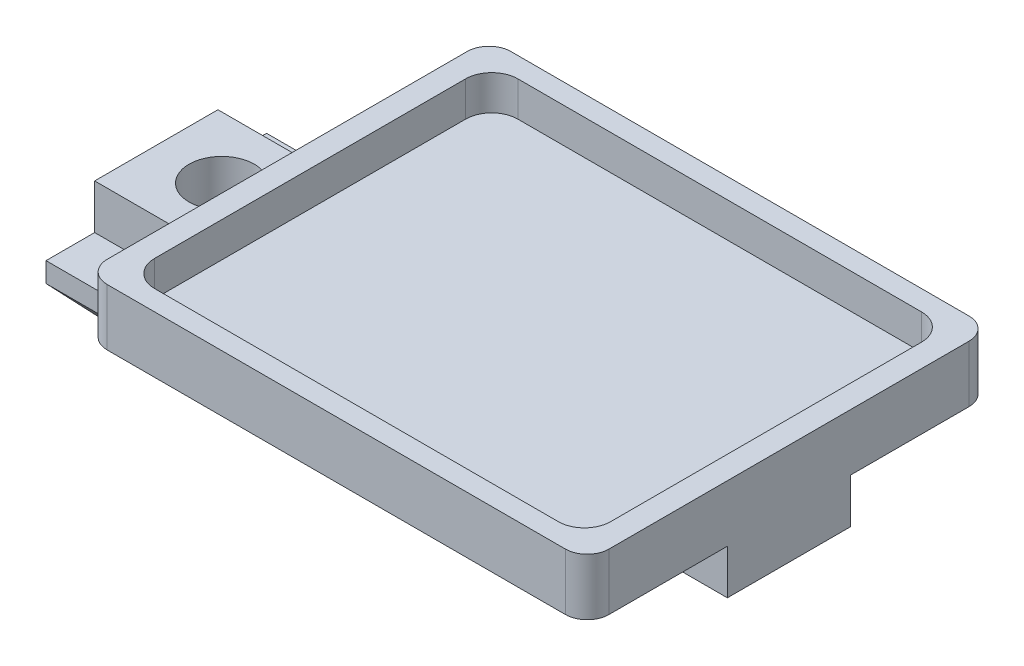
ISO-10303-21;
HEADER;
FILE_DESCRIPTION(('STEP AP214'),'2;1');
FILE_NAME('part.step','',(''),(''),'','','');
FILE_SCHEMA(('AUTOMOTIVE_DESIGN { 1 0 10303 214 1 1 1 1 }'));
ENDSEC;
DATA;
#1=APPLICATION_CONTEXT('core data for automotive mechanical design processes');
#2=APPLICATION_PROTOCOL_DEFINITION('international standard','automotive_design',2000,#1);
#3=PRODUCT_CONTEXT('',#1,'mechanical');
#4=PRODUCT('Part','Part','',(#3));
#5=PRODUCT_RELATED_PRODUCT_CATEGORY('part','',(#4));
#6=PRODUCT_DEFINITION_FORMATION('','',#4);
#7=PRODUCT_DEFINITION_CONTEXT('part definition',#1,'design');
#8=PRODUCT_DEFINITION('design','',#6,#7);
#9=PRODUCT_DEFINITION_SHAPE('','',#8);
#10=(LENGTH_UNIT() NAMED_UNIT(*) SI_UNIT(.MILLI.,.METRE.));
#11=(NAMED_UNIT(*) PLANE_ANGLE_UNIT() SI_UNIT($,.RADIAN.));
#12=(NAMED_UNIT(*) SI_UNIT($,.STERADIAN.) SOLID_ANGLE_UNIT());
#13=UNCERTAINTY_MEASURE_WITH_UNIT(LENGTH_MEASURE(1.E-05),#10,'distance_accuracy_value','');
#14=(GEOMETRIC_REPRESENTATION_CONTEXT(3) GLOBAL_UNCERTAINTY_ASSIGNED_CONTEXT((#13)) GLOBAL_UNIT_ASSIGNED_CONTEXT((#10,
#11,#12)) REPRESENTATION_CONTEXT('',''));
#15=CARTESIAN_POINT('',(0.,0.,0.));
#16=DIRECTION('',(0.,0.,1.));
#17=DIRECTION('',(1.,0.,0.));
#18=AXIS2_PLACEMENT_3D('',#15,#16,#17);
#19=CARTESIAN_POINT('',(-14.5,-8.99999999999999,0.));
#20=DIRECTION('',(0.,1.,0.));
#21=DIRECTION('',(0.,0.,1.));
#22=AXIS2_PLACEMENT_3D('',#19,#20,#21);
#23=CYLINDRICAL_SURFACE('',#22,1.5);
#24=CARTESIAN_POINT('',(-14.5,0.,0.));
#25=DIRECTION('',(0.,1.,0.));
#26=DIRECTION('',(0.,0.,1.));
#27=AXIS2_PLACEMENT_3D('',#24,#25,#26);
#28=CIRCLE('',#27,1.5);
#29=CARTESIAN_POINT('',(-14.5,0.,1.5));
#30=VERTEX_POINT('',#29);
#31=EDGE_CURVE('E229',#30,#30,#28,.T.);
#32=ORIENTED_EDGE('',*,*,#31,.T.);
#33=EDGE_LOOP('',(#32));
#34=FACE_BOUND('',#33,.T.);
#35=CARTESIAN_POINT('',(-14.5,-2.85000000000087,0.));
#36=DIRECTION('',(0.,-1.,0.));
#37=DIRECTION('',(0.,0.,-1.));
#38=AXIS2_PLACEMENT_3D('',#35,#36,#37);
#39=CIRCLE('',#38,1.5);
#40=CARTESIAN_POINT('',(-14.5,-2.85000000000087,-1.5));
#41=VERTEX_POINT('',#40);
#42=EDGE_CURVE('E36',#41,#41,#39,.F.);
#43=ORIENTED_EDGE('',*,*,#42,.F.);
#44=EDGE_LOOP('',(#43));
#45=FACE_BOUND('',#44,.T.);
#46=ADVANCED_FACE('F32',(#34,#45),#23,.F.);
#47=CARTESIAN_POINT('',(0.,0.,0.));
#48=DIRECTION('',(0.,-1.,0.));
#49=DIRECTION('',(0.,0.,-1.));
#50=AXIS2_PLACEMENT_3D('',#47,#48,#49);
#51=PLANE('',#50);
#52=DIRECTION('',(0.,0.,-1.));
#53=VECTOR('',#52,1.);
#54=CARTESIAN_POINT('',(11.5,0.,9.25));
#55=LINE('',#54,#53);
#56=CARTESIAN_POINT('',(11.5,0.,-2.82500448499157));
#57=VERTEX_POINT('',#56);
#58=CARTESIAN_POINT('',(11.5,0.,-8.25));
#59=VERTEX_POINT('',#58);
#60=EDGE_CURVE('E391',#57,#59,#55,.T.);
#61=ORIENTED_EDGE('',*,*,#60,.F.);
#62=DIRECTION('',(1.,0.,0.));
#63=VECTOR('',#62,1.);
#64=CARTESIAN_POINT('',(-17.5,0.,-2.82500411367632));
#65=LINE('',#64,#63);
#66=CARTESIAN_POINT('',(-11.5,0.,-2.82500411367632));
#67=VERTEX_POINT('',#66);
#68=EDGE_CURVE('E296',#67,#57,#65,.T.);
#69=ORIENTED_EDGE('',*,*,#68,.F.);
#70=DIRECTION('',(0.,0.,1.));
#71=VECTOR('',#70,1.);
#72=CARTESIAN_POINT('',(-11.5,0.,9.25));
#73=LINE('',#72,#71);
#74=CARTESIAN_POINT('',(-11.5,0.,-8.25));
#75=VERTEX_POINT('',#74);
#76=EDGE_CURVE('E399',#75,#67,#73,.T.);
#77=ORIENTED_EDGE('',*,*,#76,.F.);
#78=CARTESIAN_POINT('',(-10.5,0.,-8.25));
#79=DIRECTION('',(0.,-1.,0.));
#80=DIRECTION('',(0.,0.,-1.));
#81=AXIS2_PLACEMENT_3D('',#78,#79,#80);
#82=CIRCLE('',#81,1.);
#83=CARTESIAN_POINT('',(-10.5,0.,-9.25));
#84=VERTEX_POINT('',#83);
#85=EDGE_CURVE('E419',#75,#84,#82,.T.);
#86=ORIENTED_EDGE('',*,*,#85,.T.);
#87=DIRECTION('',(-1.,0.,0.));
#88=VECTOR('',#87,1.);
#89=CARTESIAN_POINT('',(-11.5,0.,-9.25));
#90=LINE('',#89,#88);
#91=CARTESIAN_POINT('',(10.5,0.,-9.25));
#92=VERTEX_POINT('',#91);
#93=EDGE_CURVE('E395',#92,#84,#90,.T.);
#94=ORIENTED_EDGE('',*,*,#93,.F.);
#95=CARTESIAN_POINT('',(10.5,0.,-8.25));
#96=DIRECTION('',(0.,-1.,0.));
#97=DIRECTION('',(0.,0.,-1.));
#98=AXIS2_PLACEMENT_3D('',#95,#96,#97);
#99=CIRCLE('',#98,1.);
#100=EDGE_CURVE('E413',#92,#59,#99,.T.);
#101=ORIENTED_EDGE('',*,*,#100,.T.);
#102=EDGE_LOOP('',(#61,#69,#77,#86,#94,#101));
#103=FACE_BOUND('',#102,.T.);
#104=ADVANCED_FACE('F486',(#103),#51,.T.);
#105=DIRECTION('',(1.,0.,0.));
#106=VECTOR('',#105,1.);
#107=CARTESIAN_POINT('',(-17.5,0.,2.8249982145693));
#108=LINE('',#107,#106);
#109=CARTESIAN_POINT('',(-11.5,0.,2.8249982145693));
#110=VERTEX_POINT('',#109);
#111=CARTESIAN_POINT('',(11.5,0.,2.8249982145693));
#112=VERTEX_POINT('',#111);
#113=EDGE_CURVE('E292',#110,#112,#108,.T.);
#114=ORIENTED_EDGE('',*,*,#113,.T.);
#115=CARTESIAN_POINT('',(11.5,0.,8.25));
#116=VERTEX_POINT('',#115);
#117=EDGE_CURVE('E392',#116,#112,#55,.T.);
#118=ORIENTED_EDGE('',*,*,#117,.F.);
#119=CARTESIAN_POINT('',(10.5,0.,8.25));
#120=DIRECTION('',(0.,-1.,0.));
#121=DIRECTION('',(0.,0.,-1.));
#122=AXIS2_PLACEMENT_3D('',#119,#120,#121);
#123=CIRCLE('',#122,1.);
#124=CARTESIAN_POINT('',(10.5,0.,9.25));
#125=VERTEX_POINT('',#124);
#126=EDGE_CURVE('E411',#116,#125,#123,.T.);
#127=ORIENTED_EDGE('',*,*,#126,.T.);
#128=DIRECTION('',(1.,0.,0.));
#129=VECTOR('',#128,1.);
#130=CARTESIAN_POINT('',(-11.5,0.,9.25));
#131=LINE('',#130,#129);
#132=CARTESIAN_POINT('',(-10.5,0.,9.25));
#133=VERTEX_POINT('',#132);
#134=EDGE_CURVE('E402',#133,#125,#131,.T.);
#135=ORIENTED_EDGE('',*,*,#134,.F.);
#136=CARTESIAN_POINT('',(-10.5,0.,8.25));
#137=DIRECTION('',(0.,-1.,0.));
#138=DIRECTION('',(0.,0.,-1.));
#139=AXIS2_PLACEMENT_3D('',#136,#137,#138);
#140=CIRCLE('',#139,1.);
#141=CARTESIAN_POINT('',(-11.5,0.,8.25));
#142=VERTEX_POINT('',#141);
#143=EDGE_CURVE('E416',#133,#142,#140,.T.);
#144=ORIENTED_EDGE('',*,*,#143,.T.);
#145=EDGE_CURVE('E398',#110,#142,#73,.T.);
#146=ORIENTED_EDGE('',*,*,#145,.F.);
#147=EDGE_LOOP('',(#114,#118,#127,#135,#144,#146));
#148=FACE_BOUND('',#147,.T.);
#149=ADVANCED_FACE('F492',(#148),#51,.T.);
#150=CARTESIAN_POINT('',(11.5,1.,9.25));
#151=DIRECTION('',(-1.,0.,0.));
#152=DIRECTION('',(0.,0.,1.));
#153=AXIS2_PLACEMENT_3D('',#150,#151,#152);
#154=PLANE('',#153);
#155=ORIENTED_EDGE('',*,*,#117,.T.);
#156=DIRECTION('',(0.,1.,0.));
#157=VECTOR('',#156,1.);
#158=CARTESIAN_POINT('',(11.5,0.,2.8249982145693));
#159=LINE('',#158,#157);
#160=CARTESIAN_POINT('',(11.5,-2.05000000000086,2.8249982145693));
#161=VERTEX_POINT('',#160);
#162=EDGE_CURVE('E239',#161,#112,#159,.T.);
#163=ORIENTED_EDGE('',*,*,#162,.F.);
#164=DIRECTION('',(0.,2.43901636594014E-07,0.99999999999997));
#165=VECTOR('',#164,1.);
#166=CARTESIAN_POINT('',(11.5,-2.05000000000086,2.8249982145693));
#167=LINE('',#166,#165);
#168=CARTESIAN_POINT('',(11.5,-2.05000137804577,-2.82500448499157));
#169=VERTEX_POINT('',#168);
#170=EDGE_CURVE('E253',#169,#161,#167,.T.);
#171=ORIENTED_EDGE('',*,*,#170,.F.);
#172=DIRECTION('',(0.,-0.999999999999984,-1.81129269029981E-07));
#173=VECTOR('',#172,1.);
#174=CARTESIAN_POINT('',(11.5,-2.05000137804577,-2.82500448499157));
#175=LINE('',#174,#173);
#176=EDGE_CURVE('E254',#57,#169,#175,.T.);
#177=ORIENTED_EDGE('',*,*,#176,.F.);
#178=ORIENTED_EDGE('',*,*,#60,.T.);
#179=DIRECTION('',(0.,-1.,0.));
#180=VECTOR('',#179,1.);
#181=CARTESIAN_POINT('',(11.5,1.,-8.25));
#182=LINE('',#181,#180);
#183=CARTESIAN_POINT('',(11.5,2.6,-8.25));
#184=VERTEX_POINT('',#183);
#185=EDGE_CURVE('E434',#59,#184,#182,.F.);
#186=ORIENTED_EDGE('',*,*,#185,.T.);
#187=DIRECTION('',(0.,0.,-1.));
#188=VECTOR('',#187,1.);
#189=CARTESIAN_POINT('',(11.5,2.6,8.25));
#190=LINE('',#189,#188);
#191=CARTESIAN_POINT('',(11.5,2.6,8.25));
#192=VERTEX_POINT('',#191);
#193=EDGE_CURVE('E388',#192,#184,#190,.T.);
#194=ORIENTED_EDGE('',*,*,#193,.F.);
#195=DIRECTION('',(0.,-1.,0.));
#196=VECTOR('',#195,1.);
#197=CARTESIAN_POINT('',(11.5,1.,8.25));
#198=LINE('',#197,#196);
#199=EDGE_CURVE('E431',#192,#116,#198,.T.);
#200=ORIENTED_EDGE('',*,*,#199,.T.);
#201=EDGE_LOOP('',(#155,#163,#171,#177,#178,#186,#194,#200));
#202=FACE_BOUND('',#201,.T.);
#203=ADVANCED_FACE('F467',(#202),#154,.F.);
#204=CARTESIAN_POINT('',(-11.5,1.,-9.25));
#205=DIRECTION('',(0.,0.,1.));
#206=DIRECTION('',(1.,0.,0.));
#207=AXIS2_PLACEMENT_3D('',#204,#205,#206);
#208=PLANE('',#207);
#209=ORIENTED_EDGE('',*,*,#93,.T.);
#210=DIRECTION('',(0.,-1.,0.));
#211=VECTOR('',#210,1.);
#212=CARTESIAN_POINT('',(-10.5,1.,-9.25));
#213=LINE('',#212,#211);
#214=CARTESIAN_POINT('',(-10.5,2.6,-9.25));
#215=VERTEX_POINT('',#214);
#216=EDGE_CURVE('E424',#84,#215,#213,.F.);
#217=ORIENTED_EDGE('',*,*,#216,.T.);
#218=DIRECTION('',(-1.,0.,0.));
#219=VECTOR('',#218,1.);
#220=CARTESIAN_POINT('',(10.5,2.6,-9.25));
#221=LINE('',#220,#219);
#222=CARTESIAN_POINT('',(10.5,2.6,-9.25));
#223=VERTEX_POINT('',#222);
#224=EDGE_CURVE('E370',#223,#215,#221,.T.);
#225=ORIENTED_EDGE('',*,*,#224,.F.);
#226=DIRECTION('',(0.,-1.,0.));
#227=VECTOR('',#226,1.);
#228=CARTESIAN_POINT('',(10.5,1.,-9.25));
#229=LINE('',#228,#227);
#230=EDGE_CURVE('E421',#223,#92,#229,.T.);
#231=ORIENTED_EDGE('',*,*,#230,.T.);
#232=EDGE_LOOP('',(#209,#217,#225,#231));
#233=FACE_BOUND('',#232,.T.);
#234=ADVANCED_FACE('F575',(#233),#208,.F.);
#235=CARTESIAN_POINT('',(-11.5,1.,9.25));
#236=DIRECTION('',(1.,0.,0.));
#237=DIRECTION('',(0.,0.,-1.));
#238=AXIS2_PLACEMENT_3D('',#235,#236,#237);
#239=PLANE('',#238);
#240=DIRECTION('',(0.,-1.,0.));
#241=VECTOR('',#240,1.);
#242=CARTESIAN_POINT('',(-11.5,1.,8.25));
#243=LINE('',#242,#241);
#244=CARTESIAN_POINT('',(-11.5,2.6,8.25));
#245=VERTEX_POINT('',#244);
#246=EDGE_CURVE('E406',#142,#245,#243,.F.);
#247=ORIENTED_EDGE('',*,*,#246,.T.);
#248=DIRECTION('',(0.,0.,1.));
#249=VECTOR('',#248,1.);
#250=CARTESIAN_POINT('',(-11.5,2.6,-8.25));
#251=LINE('',#250,#249);
#252=CARTESIAN_POINT('',(-11.5,2.6,-8.25));
#253=VERTEX_POINT('',#252);
#254=EDGE_CURVE('E376',#253,#245,#251,.T.);
#255=ORIENTED_EDGE('',*,*,#254,.F.);
#256=DIRECTION('',(0.,-1.,0.));
#257=VECTOR('',#256,1.);
#258=CARTESIAN_POINT('',(-11.5,1.,-8.25));
#259=LINE('',#258,#257);
#260=EDGE_CURVE('E408',#253,#75,#259,.T.);
#261=ORIENTED_EDGE('',*,*,#260,.T.);
#262=ORIENTED_EDGE('',*,*,#76,.T.);
#263=EDGE_CURVE('E403',#67,#110,#73,.T.);
#264=ORIENTED_EDGE('',*,*,#263,.T.);
#265=ORIENTED_EDGE('',*,*,#145,.T.);
#266=EDGE_LOOP('',(#247,#255,#261,#262,#264,#265));
#267=FACE_BOUND('',#266,.T.);
#268=ADVANCED_FACE('F571',(#267),#239,.F.);
#269=CARTESIAN_POINT('',(-11.5,1.,9.25));
#270=DIRECTION('',(0.,0.,-1.));
#271=DIRECTION('',(-1.,0.,0.));
#272=AXIS2_PLACEMENT_3D('',#269,#270,#271);
#273=PLANE('',#272);
#274=DIRECTION('',(0.,-1.,0.));
#275=VECTOR('',#274,1.);
#276=CARTESIAN_POINT('',(10.5,1.,9.25));
#277=LINE('',#276,#275);
#278=CARTESIAN_POINT('',(10.5,2.6,9.25));
#279=VERTEX_POINT('',#278);
#280=EDGE_CURVE('E426',#125,#279,#277,.F.);
#281=ORIENTED_EDGE('',*,*,#280,.T.);
#282=DIRECTION('',(1.,0.,0.));
#283=VECTOR('',#282,1.);
#284=CARTESIAN_POINT('',(-10.5,2.6,9.25));
#285=LINE('',#284,#283);
#286=CARTESIAN_POINT('',(-10.5,2.6,9.25));
#287=VERTEX_POINT('',#286);
#288=EDGE_CURVE('E382',#287,#279,#285,.T.);
#289=ORIENTED_EDGE('',*,*,#288,.F.);
#290=DIRECTION('',(0.,-1.,0.));
#291=VECTOR('',#290,1.);
#292=CARTESIAN_POINT('',(-10.5,1.,9.25));
#293=LINE('',#292,#291);
#294=EDGE_CURVE('E428',#287,#133,#293,.T.);
#295=ORIENTED_EDGE('',*,*,#294,.T.);
#296=ORIENTED_EDGE('',*,*,#134,.T.);
#297=EDGE_LOOP('',(#281,#289,#295,#296));
#298=FACE_BOUND('',#297,.T.);
#299=ADVANCED_FACE('F567',(#298),#273,.F.);
#300=CARTESIAN_POINT('',(-10.5,1.,-8.25));
#301=DIRECTION('',(0.,-1.,0.));
#302=DIRECTION('',(0.,0.,-1.));
#303=AXIS2_PLACEMENT_3D('',#300,#301,#302);
#304=CYLINDRICAL_SURFACE('',#303,1.);
#305=ORIENTED_EDGE('',*,*,#260,.F.);
#306=CARTESIAN_POINT('',(-10.5,2.6,-8.25));
#307=DIRECTION('',(0.,1.,0.));
#308=DIRECTION('',(0.,0.,1.));
#309=AXIS2_PLACEMENT_3D('',#306,#307,#308);
#310=CIRCLE('',#309,0.999999999999997);
#311=EDGE_CURVE('E373',#215,#253,#310,.T.);
#312=ORIENTED_EDGE('',*,*,#311,.F.);
#313=ORIENTED_EDGE('',*,*,#216,.F.);
#314=ORIENTED_EDGE('',*,*,#85,.F.);
#315=EDGE_LOOP('',(#305,#312,#313,#314));
#316=FACE_BOUND('',#315,.T.);
#317=ADVANCED_FACE('F570',(#316),#304,.T.);
#318=CARTESIAN_POINT('',(-10.5,1.,8.25));
#319=DIRECTION('',(0.,-1.,0.));
#320=DIRECTION('',(0.,0.,-1.));
#321=AXIS2_PLACEMENT_3D('',#318,#319,#320);
#322=CYLINDRICAL_SURFACE('',#321,1.);
#323=ORIENTED_EDGE('',*,*,#294,.F.);
#324=CARTESIAN_POINT('',(-10.5,2.6,8.25));
#325=DIRECTION('',(0.,1.,0.));
#326=DIRECTION('',(0.,0.,1.));
#327=AXIS2_PLACEMENT_3D('',#324,#325,#326);
#328=CIRCLE('',#327,0.999999999999999);
#329=EDGE_CURVE('E379',#245,#287,#328,.T.);
#330=ORIENTED_EDGE('',*,*,#329,.F.);
#331=ORIENTED_EDGE('',*,*,#246,.F.);
#332=ORIENTED_EDGE('',*,*,#143,.F.);
#333=EDGE_LOOP('',(#323,#330,#331,#332));
#334=FACE_BOUND('',#333,.T.);
#335=ADVANCED_FACE('F584',(#334),#322,.T.);
#336=CARTESIAN_POINT('',(10.5,1.,-8.25));
#337=DIRECTION('',(0.,-1.,0.));
#338=DIRECTION('',(0.,0.,-1.));
#339=AXIS2_PLACEMENT_3D('',#336,#337,#338);
#340=CYLINDRICAL_SURFACE('',#339,1.);
#341=ORIENTED_EDGE('',*,*,#230,.F.);
#342=CARTESIAN_POINT('',(10.5,2.6,-8.25));
#343=DIRECTION('',(0.,1.,0.));
#344=DIRECTION('',(0.,0.,1.));
#345=AXIS2_PLACEMENT_3D('',#342,#343,#344);
#346=CIRCLE('',#345,1.);
#347=EDGE_CURVE('E367',#184,#223,#346,.T.);
#348=ORIENTED_EDGE('',*,*,#347,.F.);
#349=ORIENTED_EDGE('',*,*,#185,.F.);
#350=ORIENTED_EDGE('',*,*,#100,.F.);
#351=EDGE_LOOP('',(#341,#348,#349,#350));
#352=FACE_BOUND('',#351,.T.);
#353=ADVANCED_FACE('F588',(#352),#340,.T.);
#354=CARTESIAN_POINT('',(10.5,1.,8.25));
#355=DIRECTION('',(0.,-1.,0.));
#356=DIRECTION('',(0.,0.,-1.));
#357=AXIS2_PLACEMENT_3D('',#354,#355,#356);
#358=CYLINDRICAL_SURFACE('',#357,1.);
#359=ORIENTED_EDGE('',*,*,#199,.F.);
#360=CARTESIAN_POINT('',(10.5,2.6,8.25));
#361=DIRECTION('',(0.,1.,0.));
#362=DIRECTION('',(0.,0.,1.));
#363=AXIS2_PLACEMENT_3D('',#360,#361,#362);
#364=CIRCLE('',#363,0.999999999999999);
#365=EDGE_CURVE('E385',#279,#192,#364,.T.);
#366=ORIENTED_EDGE('',*,*,#365,.F.);
#367=ORIENTED_EDGE('',*,*,#280,.F.);
#368=ORIENTED_EDGE('',*,*,#126,.F.);
#369=EDGE_LOOP('',(#359,#366,#367,#368));
#370=FACE_BOUND('',#369,.T.);
#371=ADVANCED_FACE('F562',(#370),#358,.T.);
#372=CARTESIAN_POINT('',(10.5,2.6,-8.25));
#373=DIRECTION('',(0.,1.,0.));
#374=DIRECTION('',(0.,0.,1.));
#375=AXIS2_PLACEMENT_3D('',#372,#373,#374);
#376=PLANE('',#375);
#377=ORIENTED_EDGE('',*,*,#347,.T.);
#378=ORIENTED_EDGE('',*,*,#224,.T.);
#379=ORIENTED_EDGE('',*,*,#311,.T.);
#380=ORIENTED_EDGE('',*,*,#254,.T.);
#381=ORIENTED_EDGE('',*,*,#329,.T.);
#382=ORIENTED_EDGE('',*,*,#288,.T.);
#383=ORIENTED_EDGE('',*,*,#365,.T.);
#384=ORIENTED_EDGE('',*,*,#193,.T.);
#385=EDGE_LOOP('',(#377,#378,#379,#380,#381,#382,#383,#384));
#386=FACE_BOUND('',#385,.T.);
#387=DIRECTION('',(0.,0.,1.));
#388=VECTOR('',#387,1.);
#389=CARTESIAN_POINT('',(-10.45,2.6,-7.125));
#390=LINE('',#389,#388);
#391=CARTESIAN_POINT('',(-10.45,2.6,-7.125));
#392=VERTEX_POINT('',#391);
#393=CARTESIAN_POINT('',(-10.45,2.6,7.125));
#394=VERTEX_POINT('',#393);
#395=EDGE_CURVE('E312',#392,#394,#390,.T.);
#396=ORIENTED_EDGE('',*,*,#395,.F.);
#397=CARTESIAN_POINT('',(-9.25,2.6,-7.125));
#398=DIRECTION('',(0.,1.,0.));
#399=DIRECTION('',(0.,0.,1.));
#400=AXIS2_PLACEMENT_3D('',#397,#398,#399);
#401=CIRCLE('',#400,1.2);
#402=CARTESIAN_POINT('',(-9.25,2.6,-8.325));
#403=VERTEX_POINT('',#402);
#404=EDGE_CURVE('E310',#403,#392,#401,.T.);
#405=ORIENTED_EDGE('',*,*,#404,.F.);
#406=DIRECTION('',(-1.,0.,0.));
#407=VECTOR('',#406,1.);
#408=CARTESIAN_POINT('',(9.25,2.6,-8.325));
#409=LINE('',#408,#407);
#410=CARTESIAN_POINT('',(9.25,2.6,-8.325));
#411=VERTEX_POINT('',#410);
#412=EDGE_CURVE('E326',#411,#403,#409,.T.);
#413=ORIENTED_EDGE('',*,*,#412,.F.);
#414=CARTESIAN_POINT('',(9.25,2.6,-7.125));
#415=DIRECTION('',(0.,1.,0.));
#416=DIRECTION('',(0.,0.,1.));
#417=AXIS2_PLACEMENT_3D('',#414,#415,#416);
#418=CIRCLE('',#417,1.2);
#419=CARTESIAN_POINT('',(10.45,2.6,-7.125));
#420=VERTEX_POINT('',#419);
#421=EDGE_CURVE('E323',#420,#411,#418,.T.);
#422=ORIENTED_EDGE('',*,*,#421,.F.);
#423=DIRECTION('',(0.,0.,-1.));
#424=VECTOR('',#423,1.);
#425=CARTESIAN_POINT('',(10.45,2.6,7.125));
#426=LINE('',#425,#424);
#427=CARTESIAN_POINT('',(10.45,2.6,7.125));
#428=VERTEX_POINT('',#427);
#429=EDGE_CURVE('E321',#428,#420,#426,.T.);
#430=ORIENTED_EDGE('',*,*,#429,.F.);
#431=CARTESIAN_POINT('',(9.25,2.6,7.125));
#432=DIRECTION('',(0.,1.,0.));
#433=DIRECTION('',(0.,0.,1.));
#434=AXIS2_PLACEMENT_3D('',#431,#432,#433);
#435=CIRCLE('',#434,1.2);
#436=CARTESIAN_POINT('',(9.25,2.6,8.325));
#437=VERTEX_POINT('',#436);
#438=EDGE_CURVE('E319',#437,#428,#435,.T.);
#439=ORIENTED_EDGE('',*,*,#438,.F.);
#440=DIRECTION('',(1.,0.,0.));
#441=VECTOR('',#440,1.);
#442=CARTESIAN_POINT('',(-9.25,2.6,8.325));
#443=LINE('',#442,#441);
#444=CARTESIAN_POINT('',(-9.25,2.6,8.325));
#445=VERTEX_POINT('',#444);
#446=EDGE_CURVE('E317',#445,#437,#443,.T.);
#447=ORIENTED_EDGE('',*,*,#446,.F.);
#448=CARTESIAN_POINT('',(-9.25,2.6,7.125));
#449=DIRECTION('',(0.,1.,0.));
#450=DIRECTION('',(0.,0.,1.));
#451=AXIS2_PLACEMENT_3D('',#448,#449,#450);
#452=CIRCLE('',#451,1.2);
#453=EDGE_CURVE('E315',#394,#445,#452,.T.);
#454=ORIENTED_EDGE('',*,*,#453,.F.);
#455=EDGE_LOOP('',(#396,#405,#413,#422,#430,#439,#447,#454));
#456=FACE_BOUND('',#455,.T.);
#457=ADVANCED_FACE('F558',(#386,#456),#376,.T.);
#458=CARTESIAN_POINT('',(-9.25,2.6,-7.125));
#459=DIRECTION('',(0.,-1.,0.));
#460=DIRECTION('',(0.,0.,-1.));
#461=AXIS2_PLACEMENT_3D('',#458,#459,#460);
#462=CYLINDRICAL_SURFACE('',#461,1.2);
#463=CARTESIAN_POINT('',(-9.25,1.,-7.125));
#464=DIRECTION('',(0.,1.,0.));
#465=DIRECTION('',(0.,0.,1.));
#466=AXIS2_PLACEMENT_3D('',#463,#464,#465);
#467=CIRCLE('',#466,1.2);
#468=CARTESIAN_POINT('',(-9.25,1.,-8.325));
#469=VERTEX_POINT('',#468);
#470=CARTESIAN_POINT('',(-10.45,1.,-7.125));
#471=VERTEX_POINT('',#470);
#472=EDGE_CURVE('E290',#469,#471,#467,.T.);
#473=ORIENTED_EDGE('',*,*,#472,.F.);
#474=DIRECTION('',(0.,-1.,0.));
#475=VECTOR('',#474,1.);
#476=CARTESIAN_POINT('',(-9.25,2.6,-8.325));
#477=LINE('',#476,#475);
#478=EDGE_CURVE('E328',#403,#469,#477,.T.);
#479=ORIENTED_EDGE('',*,*,#478,.F.);
#480=ORIENTED_EDGE('',*,*,#404,.T.);
#481=DIRECTION('',(0.,-1.,0.));
#482=VECTOR('',#481,1.);
#483=CARTESIAN_POINT('',(-10.45,2.6,-7.125));
#484=LINE('',#483,#482);
#485=EDGE_CURVE('E364',#392,#471,#484,.T.);
#486=ORIENTED_EDGE('',*,*,#485,.T.);
#487=EDGE_LOOP('',(#473,#479,#480,#486));
#488=FACE_BOUND('',#487,.T.);
#489=ADVANCED_FACE('F554',(#488),#462,.F.);
#490=CARTESIAN_POINT('',(-10.45,2.6,-7.125));
#491=DIRECTION('',(1.,0.,0.));
#492=DIRECTION('',(0.,0.,-1.));
#493=AXIS2_PLACEMENT_3D('',#490,#491,#492);
#494=PLANE('',#493);
#495=DIRECTION('',(0.,0.,1.));
#496=VECTOR('',#495,1.);
#497=CARTESIAN_POINT('',(-10.45,1.,-7.125));
#498=LINE('',#497,#496);
#499=CARTESIAN_POINT('',(-10.45,1.,7.125));
#500=VERTEX_POINT('',#499);
#501=EDGE_CURVE('E331',#471,#500,#498,.T.);
#502=ORIENTED_EDGE('',*,*,#501,.F.);
#503=ORIENTED_EDGE('',*,*,#485,.F.);
#504=ORIENTED_EDGE('',*,*,#395,.T.);
#505=DIRECTION('',(0.,-1.,0.));
#506=VECTOR('',#505,1.);
#507=CARTESIAN_POINT('',(-10.45,2.6,7.125));
#508=LINE('',#507,#506);
#509=EDGE_CURVE('E362',#394,#500,#508,.T.);
#510=ORIENTED_EDGE('',*,*,#509,.T.);
#511=EDGE_LOOP('',(#502,#503,#504,#510));
#512=FACE_BOUND('',#511,.T.);
#513=ADVANCED_FACE('F550',(#512),#494,.T.);
#514=CARTESIAN_POINT('',(-9.25,2.6,7.125));
#515=DIRECTION('',(0.,-1.,0.));
#516=DIRECTION('',(0.,0.,-1.));
#517=AXIS2_PLACEMENT_3D('',#514,#515,#516);
#518=CYLINDRICAL_SURFACE('',#517,1.2);
#519=CARTESIAN_POINT('',(-9.25,1.,7.125));
#520=DIRECTION('',(0.,1.,0.));
#521=DIRECTION('',(0.,0.,1.));
#522=AXIS2_PLACEMENT_3D('',#519,#520,#521);
#523=CIRCLE('',#522,1.2);
#524=CARTESIAN_POINT('',(-9.25,1.,8.325));
#525=VERTEX_POINT('',#524);
#526=EDGE_CURVE('E334',#500,#525,#523,.T.);
#527=ORIENTED_EDGE('',*,*,#526,.F.);
#528=ORIENTED_EDGE('',*,*,#509,.F.);
#529=ORIENTED_EDGE('',*,*,#453,.T.);
#530=DIRECTION('',(0.,-1.,0.));
#531=VECTOR('',#530,1.);
#532=CARTESIAN_POINT('',(-9.25,2.6,8.325));
#533=LINE('',#532,#531);
#534=EDGE_CURVE('E360',#445,#525,#533,.T.);
#535=ORIENTED_EDGE('',*,*,#534,.T.);
#536=EDGE_LOOP('',(#527,#528,#529,#535));
#537=FACE_BOUND('',#536,.T.);
#538=ADVANCED_FACE('F546',(#537),#518,.F.);
#539=CARTESIAN_POINT('',(-9.25,2.6,8.325));
#540=DIRECTION('',(0.,0.,-1.));
#541=DIRECTION('',(-1.,0.,0.));
#542=AXIS2_PLACEMENT_3D('',#539,#540,#541);
#543=PLANE('',#542);
#544=DIRECTION('',(1.,0.,0.));
#545=VECTOR('',#544,1.);
#546=CARTESIAN_POINT('',(-9.25,1.,8.325));
#547=LINE('',#546,#545);
#548=CARTESIAN_POINT('',(9.25,1.,8.325));
#549=VERTEX_POINT('',#548);
#550=EDGE_CURVE('E337',#525,#549,#547,.T.);
#551=ORIENTED_EDGE('',*,*,#550,.F.);
#552=ORIENTED_EDGE('',*,*,#534,.F.);
#553=ORIENTED_EDGE('',*,*,#446,.T.);
#554=DIRECTION('',(0.,-1.,0.));
#555=VECTOR('',#554,1.);
#556=CARTESIAN_POINT('',(9.25,2.6,8.325));
#557=LINE('',#556,#555);
#558=EDGE_CURVE('E358',#437,#549,#557,.T.);
#559=ORIENTED_EDGE('',*,*,#558,.T.);
#560=EDGE_LOOP('',(#551,#552,#553,#559));
#561=FACE_BOUND('',#560,.T.);
#562=ADVANCED_FACE('F542',(#561),#543,.T.);
#563=CARTESIAN_POINT('',(9.25,2.6,7.125));
#564=DIRECTION('',(0.,-1.,0.));
#565=DIRECTION('',(0.,0.,-1.));
#566=AXIS2_PLACEMENT_3D('',#563,#564,#565);
#567=CYLINDRICAL_SURFACE('',#566,1.2);
#568=CARTESIAN_POINT('',(9.25,1.,7.125));
#569=DIRECTION('',(0.,1.,0.));
#570=DIRECTION('',(0.,0.,1.));
#571=AXIS2_PLACEMENT_3D('',#568,#569,#570);
#572=CIRCLE('',#571,1.2);
#573=CARTESIAN_POINT('',(10.45,1.,7.125));
#574=VERTEX_POINT('',#573);
#575=EDGE_CURVE('E340',#549,#574,#572,.T.);
#576=ORIENTED_EDGE('',*,*,#575,.F.);
#577=ORIENTED_EDGE('',*,*,#558,.F.);
#578=ORIENTED_EDGE('',*,*,#438,.T.);
#579=DIRECTION('',(0.,-1.,0.));
#580=VECTOR('',#579,1.);
#581=CARTESIAN_POINT('',(10.45,2.6,7.125));
#582=LINE('',#581,#580);
#583=EDGE_CURVE('E356',#428,#574,#582,.T.);
#584=ORIENTED_EDGE('',*,*,#583,.T.);
#585=EDGE_LOOP('',(#576,#577,#578,#584));
#586=FACE_BOUND('',#585,.T.);
#587=ADVANCED_FACE('F538',(#586),#567,.F.);
#588=CARTESIAN_POINT('',(10.45,2.6,7.125));
#589=DIRECTION('',(-1.,0.,0.));
#590=DIRECTION('',(0.,0.,1.));
#591=AXIS2_PLACEMENT_3D('',#588,#589,#590);
#592=PLANE('',#591);
#593=DIRECTION('',(0.,0.,-1.));
#594=VECTOR('',#593,1.);
#595=CARTESIAN_POINT('',(10.45,1.,7.125));
#596=LINE('',#595,#594);
#597=CARTESIAN_POINT('',(10.45,1.,-7.125));
#598=VERTEX_POINT('',#597);
#599=EDGE_CURVE('E343',#574,#598,#596,.T.);
#600=ORIENTED_EDGE('',*,*,#599,.F.);
#601=ORIENTED_EDGE('',*,*,#583,.F.);
#602=ORIENTED_EDGE('',*,*,#429,.T.);
#603=DIRECTION('',(0.,-1.,0.));
#604=VECTOR('',#603,1.);
#605=CARTESIAN_POINT('',(10.45,2.6,-7.125));
#606=LINE('',#605,#604);
#607=EDGE_CURVE('E354',#420,#598,#606,.T.);
#608=ORIENTED_EDGE('',*,*,#607,.T.);
#609=EDGE_LOOP('',(#600,#601,#602,#608));
#610=FACE_BOUND('',#609,.T.);
#611=ADVANCED_FACE('F534',(#610),#592,.T.);
#612=CARTESIAN_POINT('',(9.25,2.6,-7.125));
#613=DIRECTION('',(0.,-1.,0.));
#614=DIRECTION('',(0.,0.,-1.));
#615=AXIS2_PLACEMENT_3D('',#612,#613,#614);
#616=CYLINDRICAL_SURFACE('',#615,1.2);
#617=CARTESIAN_POINT('',(9.25,1.,-7.125));
#618=DIRECTION('',(0.,1.,0.));
#619=DIRECTION('',(0.,0.,1.));
#620=AXIS2_PLACEMENT_3D('',#617,#618,#619);
#621=CIRCLE('',#620,1.2);
#622=CARTESIAN_POINT('',(9.25,1.,-8.325));
#623=VERTEX_POINT('',#622);
#624=EDGE_CURVE('E346',#598,#623,#621,.T.);
#625=ORIENTED_EDGE('',*,*,#624,.F.);
#626=ORIENTED_EDGE('',*,*,#607,.F.);
#627=ORIENTED_EDGE('',*,*,#421,.T.);
#628=DIRECTION('',(0.,-1.,0.));
#629=VECTOR('',#628,1.);
#630=CARTESIAN_POINT('',(9.25,2.6,-8.325));
#631=LINE('',#630,#629);
#632=EDGE_CURVE('E352',#411,#623,#631,.T.);
#633=ORIENTED_EDGE('',*,*,#632,.T.);
#634=EDGE_LOOP('',(#625,#626,#627,#633));
#635=FACE_BOUND('',#634,.T.);
#636=ADVANCED_FACE('F530',(#635),#616,.F.);
#637=CARTESIAN_POINT('',(9.25,2.6,-8.325));
#638=DIRECTION('',(0.,0.,1.));
#639=DIRECTION('',(1.,0.,0.));
#640=AXIS2_PLACEMENT_3D('',#637,#638,#639);
#641=PLANE('',#640);
#642=DIRECTION('',(-1.,0.,0.));
#643=VECTOR('',#642,1.);
#644=CARTESIAN_POINT('',(9.25,1.,-8.325));
#645=LINE('',#644,#643);
#646=EDGE_CURVE('E313',#623,#469,#645,.T.);
#647=ORIENTED_EDGE('',*,*,#646,.F.);
#648=ORIENTED_EDGE('',*,*,#632,.F.);
#649=ORIENTED_EDGE('',*,*,#412,.T.);
#650=ORIENTED_EDGE('',*,*,#478,.T.);
#651=EDGE_LOOP('',(#647,#648,#649,#650));
#652=FACE_BOUND('',#651,.T.);
#653=ADVANCED_FACE('F527',(#652),#641,.T.);
#654=CARTESIAN_POINT('',(0.,1.,0.));
#655=DIRECTION('',(0.,-1.,0.));
#656=DIRECTION('',(0.,0.,-1.));
#657=AXIS2_PLACEMENT_3D('',#654,#655,#656);
#658=PLANE('',#657);
#659=ORIENTED_EDGE('',*,*,#646,.T.);
#660=ORIENTED_EDGE('',*,*,#472,.T.);
#661=ORIENTED_EDGE('',*,*,#501,.T.);
#662=ORIENTED_EDGE('',*,*,#526,.T.);
#663=ORIENTED_EDGE('',*,*,#550,.T.);
#664=ORIENTED_EDGE('',*,*,#575,.T.);
#665=ORIENTED_EDGE('',*,*,#599,.T.);
#666=ORIENTED_EDGE('',*,*,#624,.T.);
#667=EDGE_LOOP('',(#659,#660,#661,#662,#663,#664,#665,#666));
#668=FACE_BOUND('',#667,.T.);
#669=ADVANCED_FACE('F508',(#668),#658,.F.);
#670=CARTESIAN_POINT('',(-17.5,0.,2.8249982145693));
#671=DIRECTION('',(0.,1.,0.));
#672=DIRECTION('',(0.,0.,1.));
#673=AXIS2_PLACEMENT_3D('',#670,#671,#672);
#674=PLANE('',#673);
#675=ORIENTED_EDGE('',*,*,#31,.F.);
#676=EDGE_LOOP('',(#675));
#677=FACE_BOUND('',#676,.T.);
#678=ORIENTED_EDGE('',*,*,#263,.F.);
#679=CARTESIAN_POINT('',(-17.5,0.,-2.82500411367632));
#680=VERTEX_POINT('',#679);
#681=EDGE_CURVE('E291',#680,#67,#65,.T.);
#682=ORIENTED_EDGE('',*,*,#681,.F.);
#683=DIRECTION('',(0.,0.,1.));
#684=VECTOR('',#683,1.);
#685=CARTESIAN_POINT('',(-17.5,0.,2.8249982145693));
#686=LINE('',#685,#684);
#687=CARTESIAN_POINT('',(-17.5,0.,2.8249982145693));
#688=VERTEX_POINT('',#687);
#689=EDGE_CURVE('E250',#680,#688,#686,.T.);
#690=ORIENTED_EDGE('',*,*,#689,.T.);
#691=EDGE_CURVE('E287',#688,#110,#108,.T.);
#692=ORIENTED_EDGE('',*,*,#691,.T.);
#693=EDGE_LOOP('',(#678,#682,#690,#692));
#694=FACE_BOUND('',#693,.T.);
#695=ADVANCED_FACE('F505',(#677,#694),#674,.T.);
#696=CARTESIAN_POINT('',(-17.5,-0.434236645223261,2.8249982145693));
#697=DIRECTION('',(0.,0.,1.));
#698=DIRECTION('',(1.,0.,0.));
#699=AXIS2_PLACEMENT_3D('',#696,#697,#698);
#700=PLANE('',#699);
#701=DIRECTION('',(1.,0.,0.));
#702=VECTOR('',#701,1.);
#703=CARTESIAN_POINT('',(-17.5,-2.05000000000086,2.8249982145693));
#704=LINE('',#703,#702);
#705=CARTESIAN_POINT('',(-17.5,-2.05000000000086,2.8249982145693));
#706=VERTEX_POINT('',#705);
#707=CARTESIAN_POINT('',(0.,-2.05000000000086,2.8249982145693));
#708=VERTEX_POINT('',#707);
#709=EDGE_CURVE('E236',#706,#708,#704,.T.);
#710=ORIENTED_EDGE('',*,*,#709,.T.);
#711=DIRECTION('',(-1.,0.,0.));
#712=VECTOR('',#711,1.);
#713=CARTESIAN_POINT('',(17.5104106477873,-2.05000000000086,2.8249982145693));
#714=LINE('',#713,#712);
#715=EDGE_CURVE('E246',#161,#708,#714,.T.);
#716=ORIENTED_EDGE('',*,*,#715,.F.);
#717=ORIENTED_EDGE('',*,*,#162,.T.);
#718=ORIENTED_EDGE('',*,*,#113,.F.);
#719=ORIENTED_EDGE('',*,*,#691,.F.);
#720=DIRECTION('',(0.,-1.,0.));
#721=VECTOR('',#720,1.);
#722=CARTESIAN_POINT('',(-17.5,-0.434236645223261,2.8249982145693));
#723=LINE('',#722,#721);
#724=EDGE_CURVE('E249',#688,#706,#723,.T.);
#725=ORIENTED_EDGE('',*,*,#724,.T.);
#726=EDGE_LOOP('',(#710,#716,#717,#718,#719,#725));
#727=FACE_BOUND('',#726,.T.);
#728=ADVANCED_FACE('F244',(#727),#700,.T.);
#729=CARTESIAN_POINT('',(-17.5,-0.520868560351398,-2.82500411367633));
#730=DIRECTION('',(0.,0.,-1.));
#731=DIRECTION('',(0.,1.,0.));
#732=AXIS2_PLACEMENT_3D('',#729,#730,#731);
#733=PLANE('',#732);
#734=ORIENTED_EDGE('',*,*,#68,.T.);
#735=ORIENTED_EDGE('',*,*,#176,.T.);
#736=DIRECTION('',(-1.,0.,0.));
#737=VECTOR('',#736,1.);
#738=CARTESIAN_POINT('',(17.5104106477873,-2.05000137804577,-2.82500448499157));
#739=LINE('',#738,#737);
#740=CARTESIAN_POINT('',(0.,-2.05000137804577,-2.82500448499157));
#741=VERTEX_POINT('',#740);
#742=EDGE_CURVE('E228',#169,#741,#739,.T.);
#743=ORIENTED_EDGE('',*,*,#742,.T.);
#744=DIRECTION('',(1.,0.,0.));
#745=VECTOR('',#744,1.);
#746=CARTESIAN_POINT('',(-17.5,-2.05000137804577,-2.82500448499157));
#747=LINE('',#746,#745);
#748=CARTESIAN_POINT('',(-17.5,-2.05000137804577,-2.82500448499157));
#749=VERTEX_POINT('',#748);
#750=EDGE_CURVE('E295',#749,#741,#747,.T.);
#751=ORIENTED_EDGE('',*,*,#750,.F.);
#752=DIRECTION('',(0.,0.99999999999997,2.42827332598546E-07));
#753=VECTOR('',#752,1.);
#754=CARTESIAN_POINT('',(-17.5,-2.05000137804577,-2.82500448499157));
#755=LINE('',#754,#753);
#756=EDGE_CURVE('E282',#749,#680,#755,.T.);
#757=ORIENTED_EDGE('',*,*,#756,.T.);
#758=ORIENTED_EDGE('',*,*,#681,.T.);
#759=EDGE_LOOP('',(#734,#735,#743,#751,#757,#758));
#760=FACE_BOUND('',#759,.T.);
#761=ADVANCED_FACE('F462',(#760),#733,.T.);
#762=CARTESIAN_POINT('',(-17.5,-2.05000083662551,-5.05465590707345));
#763=DIRECTION('',(0.,0.999999999999971,2.42827308289765E-07));
#764=DIRECTION('',(0.,-2.42827308289765E-07,0.999999999999971));
#765=AXIS2_PLACEMENT_3D('',#762,#763,#764);
#766=PLANE('',#765);
#767=DIRECTION('',(0.,-2.42827308289765E-07,0.99999999999997));
#768=VECTOR('',#767,1.);
#769=CARTESIAN_POINT('',(0.,-2.05000083662551,-5.05465590707345));
#770=LINE('',#769,#768);
#771=CARTESIAN_POINT('',(0.,-2.05000083662551,-5.05465590707345));
#772=VERTEX_POINT('',#771);
#773=EDGE_CURVE('E224',#772,#741,#770,.T.);
#774=ORIENTED_EDGE('',*,*,#773,.F.);
#775=DIRECTION('',(1.,0.,0.));
#776=VECTOR('',#775,1.);
#777=CARTESIAN_POINT('',(-17.5,-2.05000083662551,-5.05465590707345));
#778=LINE('',#777,#776);
#779=CARTESIAN_POINT('',(-17.5,-2.05000083662551,-5.05465590707345));
#780=VERTEX_POINT('',#779);
#781=EDGE_CURVE('E298',#780,#772,#778,.T.);
#782=ORIENTED_EDGE('',*,*,#781,.F.);
#783=DIRECTION('',(0.,-2.42827308289765E-07,0.99999999999997));
#784=VECTOR('',#783,1.);
#785=CARTESIAN_POINT('',(-17.5,-2.05000083662551,-5.05465590707345));
#786=LINE('',#785,#784);
#787=EDGE_CURVE('E279',#780,#749,#786,.T.);
#788=ORIENTED_EDGE('',*,*,#787,.T.);
#789=ORIENTED_EDGE('',*,*,#750,.T.);
#790=EDGE_LOOP('',(#774,#782,#788,#789));
#791=FACE_BOUND('',#790,.T.);
#792=ADVANCED_FACE('F460',(#791),#766,.T.);
#793=CARTESIAN_POINT('',(-17.5,-3.09644660940693,-5.05465590707345));
#794=DIRECTION('',(0.,0.,-1.));
#795=DIRECTION('',(-1.,0.,0.));
#796=AXIS2_PLACEMENT_3D('',#793,#794,#795);
#797=PLANE('',#796);
#798=ORIENTED_EDGE('',*,*,#781,.T.);
#799=CARTESIAN_POINT('',(-5.58211429478115,0.149999999999128,-5.05465590707345));
#800=DIRECTION('',(0.,0.,-1.));
#801=DIRECTION('',(-1.,0.,0.));
#802=AXIS2_PLACEMENT_3D('',#799,#800,#801);
#803=CIRCLE('',#802,6.);
#804=CARTESIAN_POINT('',(-0.536266059620302,-3.09644660940693,-5.05465590707345));
#805=VERTEX_POINT('',#804);
#806=EDGE_CURVE('E436',#772,#805,#803,.T.);
#807=ORIENTED_EDGE('',*,*,#806,.T.);
#808=DIRECTION('',(1.,0.,0.));
#809=VECTOR('',#808,1.);
#810=CARTESIAN_POINT('',(-17.5,-3.09644660940693,-5.05465590707345));
#811=LINE('',#810,#809);
#812=CARTESIAN_POINT('',(-17.5,-3.09644660940693,-5.05465590707345));
#813=VERTEX_POINT('',#812);
#814=EDGE_CURVE('E300',#813,#805,#811,.T.);
#815=ORIENTED_EDGE('',*,*,#814,.F.);
#816=DIRECTION('',(0.,1.,0.));
#817=VECTOR('',#816,1.);
#818=CARTESIAN_POINT('',(-17.5,-3.09644660940693,-5.05465590707345));
#819=LINE('',#818,#817);
#820=EDGE_CURVE('E276',#813,#780,#819,.T.);
#821=ORIENTED_EDGE('',*,*,#820,.T.);
#822=EDGE_LOOP('',(#798,#807,#815,#821));
#823=FACE_BOUND('',#822,.T.);
#824=ADVANCED_FACE('F458',(#823),#797,.T.);
#825=CARTESIAN_POINT('',(-17.5,-5.85000000000087,-2.30110251647951));
#826=DIRECTION('',(0.,-0.707106781186548,-0.707106781186548));
#827=DIRECTION('',(0.,0.707106781186548,-0.707106781186548));
#828=AXIS2_PLACEMENT_3D('',#825,#826,#827);
#829=PLANE('',#828);
#830=ORIENTED_EDGE('',*,*,#814,.T.);
#831=CARTESIAN_POINT('',(-5.58211429478115,0.149999999999128,-8.30110251647951));
#832=DIRECTION('',(0.,-0.707106781186548,-0.707106781186548));
#833=DIRECTION('',(0.,0.707106781186548,-0.707106781186548));
#834=AXIS2_PLACEMENT_3D('',#831,#832,#833);
#835=ELLIPSE('',#834,8.48528137423857,6.);
#836=CARTESIAN_POINT('',(-5.58211429478115,-5.85000000000087,-2.30110251647951));
#837=VERTEX_POINT('',#836);
#838=EDGE_CURVE('E438',#805,#837,#835,.T.);
#839=ORIENTED_EDGE('',*,*,#838,.T.);
#840=DIRECTION('',(1.,0.,0.));
#841=VECTOR('',#840,1.);
#842=CARTESIAN_POINT('',(-17.5,-5.85000000000087,-2.30110251647951));
#843=LINE('',#842,#841);
#844=CARTESIAN_POINT('',(-17.5,-5.85000000000087,-2.30110251647951));
#845=VERTEX_POINT('',#844);
#846=EDGE_CURVE('E303',#845,#837,#843,.T.);
#847=ORIENTED_EDGE('',*,*,#846,.F.);
#848=DIRECTION('',(0.,0.707106781186547,-0.707106781186547));
#849=VECTOR('',#848,1.);
#850=CARTESIAN_POINT('',(-17.5,-5.85000000000087,-2.30110251647951));
#851=LINE('',#850,#849);
#852=EDGE_CURVE('E273',#845,#813,#851,.T.);
#853=ORIENTED_EDGE('',*,*,#852,.T.);
#854=EDGE_LOOP('',(#830,#839,#847,#853));
#855=FACE_BOUND('',#854,.T.);
#856=ADVANCED_FACE('F443',(#855),#829,.T.);
#857=CARTESIAN_POINT('',(-17.5,-5.85000000000087,2.29762172638616));
#858=DIRECTION('',(0.,-1.,0.));
#859=DIRECTION('',(0.,0.,-1.));
#860=AXIS2_PLACEMENT_3D('',#857,#858,#859);
#861=PLANE('',#860);
#862=CARTESIAN_POINT('',(-14.5,-5.85000000000087,0.));
#863=DIRECTION('',(0.,-1.,0.));
#864=DIRECTION('',(0.,0.,-1.));
#865=AXIS2_PLACEMENT_3D('',#862,#863,#864);
#866=CIRCLE('',#865,1.85);
#867=CARTESIAN_POINT('',(-14.5,-5.85000000000087,-1.85));
#868=VERTEX_POINT('',#867);
#869=EDGE_CURVE('E473',#868,#868,#866,.T.);
#870=ORIENTED_EDGE('',*,*,#869,.F.);
#871=EDGE_LOOP('',(#870));
#872=FACE_BOUND('',#871,.T.);
#873=ORIENTED_EDGE('',*,*,#846,.T.);
#874=DIRECTION('',(0.,0.,1.));
#875=VECTOR('',#874,1.);
#876=CARTESIAN_POINT('',(-5.58211429478115,-5.85000000000087,2.29762172638616));
#877=LINE('',#876,#875);
#878=CARTESIAN_POINT('',(-5.58211429478115,-5.85000000000087,2.29762172638616));
#879=VERTEX_POINT('',#878);
#880=EDGE_CURVE('E55',#837,#879,#877,.T.);
#881=ORIENTED_EDGE('',*,*,#880,.T.);
#882=DIRECTION('',(1.,0.,0.));
#883=VECTOR('',#882,1.);
#884=CARTESIAN_POINT('',(-17.5,-5.85000000000087,2.29762172638616));
#885=LINE('',#884,#883);
#886=CARTESIAN_POINT('',(-17.5,-5.85000000000087,2.29762172638616));
#887=VERTEX_POINT('',#886);
#888=EDGE_CURVE('E305',#887,#879,#885,.T.);
#889=ORIENTED_EDGE('',*,*,#888,.F.);
#890=DIRECTION('',(0.,0.,-1.));
#891=VECTOR('',#890,1.);
#892=CARTESIAN_POINT('',(-17.5,-5.85000000000087,2.29762172638616));
#893=LINE('',#892,#891);
#894=EDGE_CURVE('E270',#887,#845,#893,.T.);
#895=ORIENTED_EDGE('',*,*,#894,.T.);
#896=EDGE_LOOP('',(#873,#881,#889,#895));
#897=FACE_BOUND('',#896,.T.);
#898=ADVANCED_FACE('F445',(#872,#897),#861,.T.);
#899=CARTESIAN_POINT('',(-17.5,-2.95951263263296,5.05465233621203));
#900=DIRECTION('',(0.,-0.690204420991452,0.723614439631946));
#901=DIRECTION('',(0.,-0.723614439631946,-0.690204420991452));
#902=AXIS2_PLACEMENT_3D('',#899,#900,#901);
#903=PLANE('',#902);
#904=ORIENTED_EDGE('',*,*,#888,.T.);
#905=CARTESIAN_POINT('',(-5.58211429478115,0.149999999999128,8.02059559083125));
#906=DIRECTION('',(0.,-0.690204420991452,0.723614439631946));
#907=DIRECTION('',(0.,-0.723614439631946,-0.690204420991452));
#908=AXIS2_PLACEMENT_3D('',#905,#906,#907);
#909=ELLIPSE('',#908,8.29170850025021,6.);
#910=CARTESIAN_POINT('',(-0.450746914881185,-2.95951263263296,5.05465233621203));
#911=VERTEX_POINT('',#910);
#912=EDGE_CURVE('E41',#879,#911,#909,.T.);
#913=ORIENTED_EDGE('',*,*,#912,.T.);
#914=DIRECTION('',(1.,0.,0.));
#915=VECTOR('',#914,1.);
#916=CARTESIAN_POINT('',(-17.5,-2.95951263263296,5.05465233621203));
#917=LINE('',#916,#915);
#918=CARTESIAN_POINT('',(-17.5,-2.95951263263296,5.05465233621203));
#919=VERTEX_POINT('',#918);
#920=EDGE_CURVE('E307',#919,#911,#917,.T.);
#921=ORIENTED_EDGE('',*,*,#920,.F.);
#922=DIRECTION('',(0.,-0.723614439631946,-0.690204420991451));
#923=VECTOR('',#922,1.);
#924=CARTESIAN_POINT('',(-17.5,-2.95951263263296,5.05465233621203));
#925=LINE('',#924,#923);
#926=EDGE_CURVE('E267',#919,#887,#925,.T.);
#927=ORIENTED_EDGE('',*,*,#926,.T.);
#928=EDGE_LOOP('',(#904,#913,#921,#927));
#929=FACE_BOUND('',#928,.T.);
#930=ADVANCED_FACE('F451',(#929),#903,.T.);
#931=CARTESIAN_POINT('',(-17.5,-2.05000000000086,5.05465233621203));
#932=DIRECTION('',(0.,0.,1.));
#933=DIRECTION('',(1.,0.,0.));
#934=AXIS2_PLACEMENT_3D('',#931,#932,#933);
#935=PLANE('',#934);
#936=ORIENTED_EDGE('',*,*,#920,.T.);
#937=CARTESIAN_POINT('',(-5.58211429478115,0.149999999999128,5.05465233621203));
#938=DIRECTION('',(0.,0.,1.));
#939=DIRECTION('',(1.,0.,0.));
#940=AXIS2_PLACEMENT_3D('',#937,#938,#939);
#941=CIRCLE('',#940,6.);
#942=CARTESIAN_POINT('',(0.,-2.05000000000086,5.05465233621203));
#943=VERTEX_POINT('',#942);
#944=EDGE_CURVE('E11',#911,#943,#941,.T.);
#945=ORIENTED_EDGE('',*,*,#944,.T.);
#946=DIRECTION('',(1.,0.,0.));
#947=VECTOR('',#946,1.);
#948=CARTESIAN_POINT('',(-17.5,-2.05000000000086,5.05465233621203));
#949=LINE('',#948,#947);
#950=CARTESIAN_POINT('',(-17.5,-2.05000000000086,5.05465233621203));
#951=VERTEX_POINT('',#950);
#952=EDGE_CURVE('E238',#951,#943,#949,.T.);
#953=ORIENTED_EDGE('',*,*,#952,.F.);
#954=DIRECTION('',(0.,-1.,0.));
#955=VECTOR('',#954,1.);
#956=CARTESIAN_POINT('',(-17.5,-2.05000000000086,5.05465233621203));
#957=LINE('',#956,#955);
#958=EDGE_CURVE('E264',#951,#919,#957,.T.);
#959=ORIENTED_EDGE('',*,*,#958,.T.);
#960=EDGE_LOOP('',(#936,#945,#953,#959));
#961=FACE_BOUND('',#960,.T.);
#962=ADVANCED_FACE('F448',(#961),#935,.T.);
#963=CARTESIAN_POINT('',(-17.5,-2.05000000000086,2.8249982145693));
#964=DIRECTION('',(0.,1.,0.));
#965=DIRECTION('',(0.,0.,1.));
#966=AXIS2_PLACEMENT_3D('',#963,#964,#965);
#967=PLANE('',#966);
#968=DIRECTION('',(0.,0.,1.));
#969=VECTOR('',#968,1.);
#970=CARTESIAN_POINT('',(0.,-2.05000000000086,2.8249982145693));
#971=LINE('',#970,#969);
#972=EDGE_CURVE('E221',#708,#943,#971,.T.);
#973=ORIENTED_EDGE('',*,*,#972,.F.);
#974=ORIENTED_EDGE('',*,*,#709,.F.);
#975=DIRECTION('',(0.,0.,1.));
#976=VECTOR('',#975,1.);
#977=CARTESIAN_POINT('',(-17.5,-2.05000000000086,2.8249982145693));
#978=LINE('',#977,#976);
#979=EDGE_CURVE('E262',#706,#951,#978,.T.);
#980=ORIENTED_EDGE('',*,*,#979,.T.);
#981=ORIENTED_EDGE('',*,*,#952,.T.);
#982=EDGE_LOOP('',(#973,#974,#980,#981));
#983=FACE_BOUND('',#982,.T.);
#984=ADVANCED_FACE('F234',(#983),#967,.T.);
#985=CARTESIAN_POINT('',(-17.5,0.,0.));
#986=DIRECTION('',(-1.,0.,0.));
#987=DIRECTION('',(0.,0.,1.));
#988=AXIS2_PLACEMENT_3D('',#985,#986,#987);
#989=PLANE('',#988);
#990=ORIENTED_EDGE('',*,*,#724,.F.);
#991=ORIENTED_EDGE('',*,*,#689,.F.);
#992=ORIENTED_EDGE('',*,*,#756,.F.);
#993=ORIENTED_EDGE('',*,*,#787,.F.);
#994=ORIENTED_EDGE('',*,*,#820,.F.);
#995=ORIENTED_EDGE('',*,*,#852,.F.);
#996=ORIENTED_EDGE('',*,*,#894,.F.);
#997=ORIENTED_EDGE('',*,*,#926,.F.);
#998=ORIENTED_EDGE('',*,*,#958,.F.);
#999=ORIENTED_EDGE('',*,*,#979,.F.);
#1000=EDGE_LOOP('',(#990,#991,#992,#993,#994,#995,#996,#997,#998,#999));
#1001=FACE_BOUND('',#1000,.T.);
#1002=ADVANCED_FACE('F453',(#1001),#989,.T.);
#1003=CARTESIAN_POINT('',(17.5104106477873,-2.05000000000086,2.8249982145693));
#1004=DIRECTION('',(0.,0.99999999999997,-2.43901636594014E-07));
#1005=DIRECTION('',(0.,2.43901636594014E-07,0.99999999999997));
#1006=AXIS2_PLACEMENT_3D('',#1003,#1004,#1005);
#1007=PLANE('',#1006);
#1008=ORIENTED_EDGE('',*,*,#742,.F.);
#1009=ORIENTED_EDGE('',*,*,#170,.T.);
#1010=ORIENTED_EDGE('',*,*,#715,.T.);
#1011=DIRECTION('',(0.,-2.43901636594014E-07,-0.99999999999997));
#1012=VECTOR('',#1011,1.);
#1013=CARTESIAN_POINT('',(0.,-2.05000000000086,2.8249982145693));
#1014=LINE('',#1013,#1012);
#1015=EDGE_CURVE('E218',#708,#741,#1014,.T.);
#1016=ORIENTED_EDGE('',*,*,#1015,.T.);
#1017=EDGE_LOOP('',(#1008,#1009,#1010,#1016));
#1018=FACE_BOUND('',#1017,.T.);
#1019=ADVANCED_FACE('F252',(#1018),#1007,.F.);
#1020=CARTESIAN_POINT('',(-5.58211429478115,0.149999999999128,0.));
#1021=DIRECTION('',(0.,0.,-1.));
#1022=DIRECTION('',(-1.,0.,0.));
#1023=AXIS2_PLACEMENT_3D('',#1020,#1021,#1022);
#1024=CYLINDRICAL_SURFACE('',#1023,6.);
#1025=ORIENTED_EDGE('',*,*,#912,.F.);
#1026=ORIENTED_EDGE('',*,*,#880,.F.);
#1027=ORIENTED_EDGE('',*,*,#838,.F.);
#1028=ORIENTED_EDGE('',*,*,#806,.F.);
#1029=ORIENTED_EDGE('',*,*,#773,.T.);
#1030=ORIENTED_EDGE('',*,*,#1015,.F.);
#1031=ORIENTED_EDGE('',*,*,#972,.T.);
#1032=ORIENTED_EDGE('',*,*,#944,.F.);
#1033=EDGE_LOOP('',(#1025,#1026,#1027,#1028,#1029,#1030,#1031,#1032));
#1034=FACE_BOUND('',#1033,.T.);
#1035=ADVANCED_FACE('F34',(#1034),#1024,.T.);
#1036=CARTESIAN_POINT('',(-14.5,-2.85000000000087,0.));
#1037=DIRECTION('',(0.,-1.,0.));
#1038=DIRECTION('',(0.,0.,-1.));
#1039=AXIS2_PLACEMENT_3D('',#1036,#1037,#1038);
#1040=PLANE('',#1039);
#1041=CARTESIAN_POINT('',(-14.5,-2.85000000000087,0.));
#1042=DIRECTION('',(0.,-1.,0.));
#1043=DIRECTION('',(0.,0.,-1.));
#1044=AXIS2_PLACEMENT_3D('',#1041,#1042,#1043);
#1045=CIRCLE('',#1044,1.85);
#1046=CARTESIAN_POINT('',(-14.5,-2.85000000000087,-1.85));
#1047=VERTEX_POINT('',#1046);
#1048=EDGE_CURVE('E476',#1047,#1047,#1045,.T.);
#1049=ORIENTED_EDGE('',*,*,#1048,.T.);
#1050=EDGE_LOOP('',(#1049));
#1051=FACE_BOUND('',#1050,.T.);
#1052=ORIENTED_EDGE('',*,*,#42,.T.);
#1053=EDGE_LOOP('',(#1052));
#1054=FACE_BOUND('',#1053,.T.);
#1055=ADVANCED_FACE('F483',(#1051,#1054),#1040,.T.);
#1056=CARTESIAN_POINT('',(-14.5,-2.85000000000087,0.));
#1057=DIRECTION('',(0.,-1.,0.));
#1058=DIRECTION('',(0.,0.,-1.));
#1059=AXIS2_PLACEMENT_3D('',#1056,#1057,#1058);
#1060=CYLINDRICAL_SURFACE('',#1059,1.85);
#1061=ORIENTED_EDGE('',*,*,#1048,.F.);
#1062=EDGE_LOOP('',(#1061));
#1063=FACE_BOUND('',#1062,.T.);
#1064=ORIENTED_EDGE('',*,*,#869,.T.);
#1065=EDGE_LOOP('',(#1064));
#1066=FACE_BOUND('',#1065,.T.);
#1067=ADVANCED_FACE('F497',(#1063,#1066),#1060,.F.);
#1068=CLOSED_SHELL('',(#46,#104,#149,#203,#234,#268,#299,#317,#335,#353,#371,#457,#489,#513,
#538,#562,#587,#611,#636,#653,#669,#695,#728,#761,#792,#824,#856,#898,#930,#962,#984,#1002,
#1019,#1035,#1055,#1067));
#1069=MANIFOLD_SOLID_BREP('B2',#1068);
#1070=ADVANCED_BREP_SHAPE_REPRESENTATION('',(#18,#1069),#14);
#1071=SHAPE_DEFINITION_REPRESENTATION(#9,#1070);
ENDSEC;
END-ISO-10303-21;
